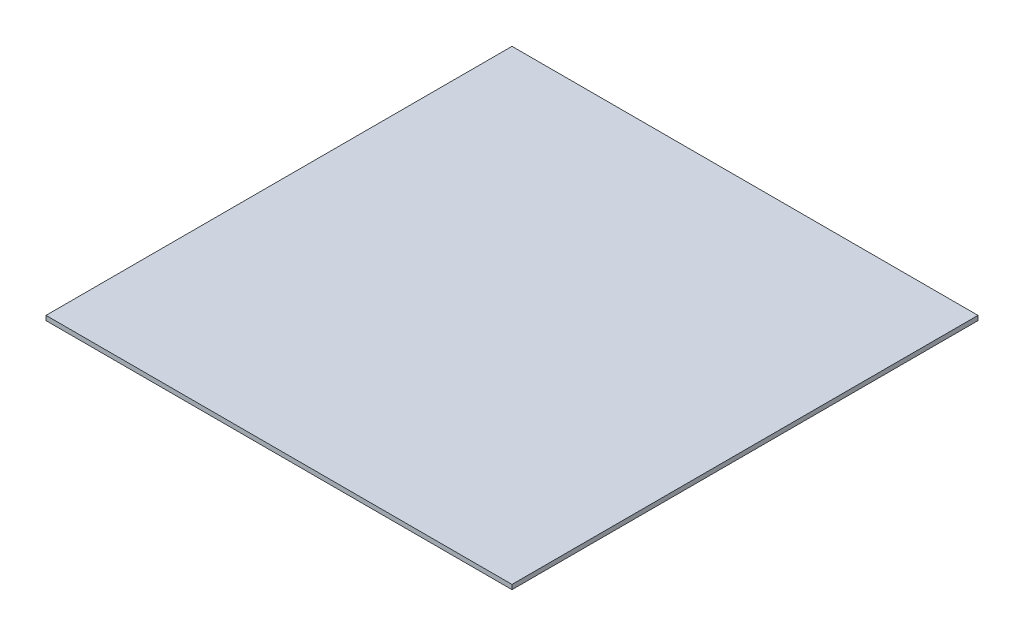
ISO-10303-21;
HEADER;
FILE_DESCRIPTION(('STEP AP214'),'2;1');
FILE_NAME('part.step','',(''),(''),'','','');
FILE_SCHEMA(('AUTOMOTIVE_DESIGN { 1 0 10303 214 1 1 1 1 }'));
ENDSEC;
DATA;
#1=APPLICATION_CONTEXT('core data for automotive mechanical design processes');
#2=APPLICATION_PROTOCOL_DEFINITION('international standard','automotive_design',2000,#1);
#3=PRODUCT_CONTEXT('',#1,'mechanical');
#4=PRODUCT('Part','Part','',(#3));
#5=PRODUCT_RELATED_PRODUCT_CATEGORY('part','',(#4));
#6=PRODUCT_DEFINITION_FORMATION('','',#4);
#7=PRODUCT_DEFINITION_CONTEXT('part definition',#1,'design');
#8=PRODUCT_DEFINITION('design','',#6,#7);
#9=PRODUCT_DEFINITION_SHAPE('','',#8);
#10=(LENGTH_UNIT() NAMED_UNIT(*) SI_UNIT(.MILLI.,.METRE.));
#11=(NAMED_UNIT(*) PLANE_ANGLE_UNIT() SI_UNIT($,.RADIAN.));
#12=(NAMED_UNIT(*) SI_UNIT($,.STERADIAN.) SOLID_ANGLE_UNIT());
#13=UNCERTAINTY_MEASURE_WITH_UNIT(LENGTH_MEASURE(1.E-05),#10,'distance_accuracy_value','');
#14=(GEOMETRIC_REPRESENTATION_CONTEXT(3) GLOBAL_UNCERTAINTY_ASSIGNED_CONTEXT((#13)) GLOBAL_UNIT_ASSIGNED_CONTEXT((#10,
#11,#12)) REPRESENTATION_CONTEXT('',''));
#15=CARTESIAN_POINT('',(0.,0.,0.));
#16=DIRECTION('',(0.,0.,1.));
#17=DIRECTION('',(1.,0.,0.));
#18=AXIS2_PLACEMENT_3D('',#15,#16,#17);
#19=CARTESIAN_POINT('',(152.4,2.9972,152.4));
#20=DIRECTION('',(-1.,0.,0.));
#21=DIRECTION('',(0.,0.,1.));
#22=AXIS2_PLACEMENT_3D('',#19,#20,#21);
#23=PLANE('',#22);
#24=DIRECTION('',(0.,0.,-1.));
#25=VECTOR('',#24,1.);
#26=CARTESIAN_POINT('',(152.4,0.,152.4));
#27=LINE('',#26,#25);
#28=CARTESIAN_POINT('',(152.4,0.,152.4));
#29=VERTEX_POINT('',#28);
#30=CARTESIAN_POINT('',(152.4,0.,-152.4));
#31=VERTEX_POINT('',#30);
#32=EDGE_CURVE('E107',#29,#31,#27,.T.);
#33=ORIENTED_EDGE('',*,*,#32,.T.);
#34=DIRECTION('',(0.,-1.,0.));
#35=VECTOR('',#34,1.);
#36=CARTESIAN_POINT('',(152.4,2.9972,-152.4));
#37=LINE('',#36,#35);
#38=CARTESIAN_POINT('',(152.4,2.9972,-152.4));
#39=VERTEX_POINT('',#38);
#40=EDGE_CURVE('E11',#39,#31,#37,.T.);
#41=ORIENTED_EDGE('',*,*,#40,.F.);
#42=DIRECTION('',(0.,0.,-1.));
#43=VECTOR('',#42,1.);
#44=CARTESIAN_POINT('',(152.4,2.9972,152.4));
#45=LINE('',#44,#43);
#46=CARTESIAN_POINT('',(152.4,2.9972,152.4));
#47=VERTEX_POINT('',#46);
#48=EDGE_CURVE('E91',#47,#39,#45,.T.);
#49=ORIENTED_EDGE('',*,*,#48,.F.);
#50=DIRECTION('',(0.,-1.,0.));
#51=VECTOR('',#50,1.);
#52=CARTESIAN_POINT('',(152.4,2.9972,152.4));
#53=LINE('',#52,#51);
#54=EDGE_CURVE('E103',#47,#29,#53,.T.);
#55=ORIENTED_EDGE('',*,*,#54,.T.);
#56=EDGE_LOOP('',(#33,#41,#49,#55));
#57=FACE_BOUND('',#56,.T.);
#58=ADVANCED_FACE('F39',(#57),#23,.F.);
#59=CARTESIAN_POINT('',(-152.4,2.9972,-152.4));
#60=DIRECTION('',(0.,0.,1.));
#61=DIRECTION('',(1.,0.,0.));
#62=AXIS2_PLACEMENT_3D('',#59,#60,#61);
#63=PLANE('',#62);
#64=DIRECTION('',(-1.,0.,0.));
#65=VECTOR('',#64,1.);
#66=CARTESIAN_POINT('',(-152.4,0.,-152.4));
#67=LINE('',#66,#65);
#68=CARTESIAN_POINT('',(-152.4,0.,-152.4));
#69=VERTEX_POINT('',#68);
#70=EDGE_CURVE('E96',#31,#69,#67,.T.);
#71=ORIENTED_EDGE('',*,*,#70,.T.);
#72=DIRECTION('',(0.,-1.,0.));
#73=VECTOR('',#72,1.);
#74=CARTESIAN_POINT('',(-152.4,2.9972,-152.4));
#75=LINE('',#74,#73);
#76=CARTESIAN_POINT('',(-152.4,2.9972,-152.4));
#77=VERTEX_POINT('',#76);
#78=EDGE_CURVE('E48',#77,#69,#75,.T.);
#79=ORIENTED_EDGE('',*,*,#78,.F.);
#80=DIRECTION('',(-1.,0.,0.));
#81=VECTOR('',#80,1.);
#82=CARTESIAN_POINT('',(-152.4,2.9972,-152.4));
#83=LINE('',#82,#81);
#84=EDGE_CURVE('E86',#39,#77,#83,.T.);
#85=ORIENTED_EDGE('',*,*,#84,.F.);
#86=ORIENTED_EDGE('',*,*,#40,.T.);
#87=EDGE_LOOP('',(#71,#79,#85,#86));
#88=FACE_BOUND('',#87,.T.);
#89=ADVANCED_FACE('F95',(#88),#63,.F.);
#90=CARTESIAN_POINT('',(-152.4,2.9972,152.4));
#91=DIRECTION('',(1.,0.,0.));
#92=DIRECTION('',(0.,0.,-1.));
#93=AXIS2_PLACEMENT_3D('',#90,#91,#92);
#94=PLANE('',#93);
#95=DIRECTION('',(0.,0.,1.));
#96=VECTOR('',#95,1.);
#97=CARTESIAN_POINT('',(-152.4,0.,152.4));
#98=LINE('',#97,#96);
#99=CARTESIAN_POINT('',(-152.4,0.,152.4));
#100=VERTEX_POINT('',#99);
#101=EDGE_CURVE('E73',#69,#100,#98,.T.);
#102=ORIENTED_EDGE('',*,*,#101,.T.);
#103=DIRECTION('',(0.,-1.,0.));
#104=VECTOR('',#103,1.);
#105=CARTESIAN_POINT('',(-152.4,2.9972,152.4));
#106=LINE('',#105,#104);
#107=CARTESIAN_POINT('',(-152.4,2.9972,152.4));
#108=VERTEX_POINT('',#107);
#109=EDGE_CURVE('E98',#108,#100,#106,.T.);
#110=ORIENTED_EDGE('',*,*,#109,.F.);
#111=DIRECTION('',(0.,0.,1.));
#112=VECTOR('',#111,1.);
#113=CARTESIAN_POINT('',(-152.4,2.9972,152.4));
#114=LINE('',#113,#112);
#115=EDGE_CURVE('E89',#77,#108,#114,.T.);
#116=ORIENTED_EDGE('',*,*,#115,.F.);
#117=ORIENTED_EDGE('',*,*,#78,.T.);
#118=EDGE_LOOP('',(#102,#110,#116,#117));
#119=FACE_BOUND('',#118,.T.);
#120=ADVANCED_FACE('F99',(#119),#94,.F.);
#121=CARTESIAN_POINT('',(-152.4,2.9972,152.4));
#122=DIRECTION('',(0.,0.,-1.));
#123=DIRECTION('',(-1.,0.,0.));
#124=AXIS2_PLACEMENT_3D('',#121,#122,#123);
#125=PLANE('',#124);
#126=DIRECTION('',(1.,0.,0.));
#127=VECTOR('',#126,1.);
#128=CARTESIAN_POINT('',(-152.4,0.,152.4));
#129=LINE('',#128,#127);
#130=EDGE_CURVE('E79',#100,#29,#129,.T.);
#131=ORIENTED_EDGE('',*,*,#130,.T.);
#132=ORIENTED_EDGE('',*,*,#54,.F.);
#133=DIRECTION('',(1.,0.,0.));
#134=VECTOR('',#133,1.);
#135=CARTESIAN_POINT('',(-152.4,2.9972,152.4));
#136=LINE('',#135,#134);
#137=EDGE_CURVE('E56',#108,#47,#136,.T.);
#138=ORIENTED_EDGE('',*,*,#137,.F.);
#139=ORIENTED_EDGE('',*,*,#109,.T.);
#140=EDGE_LOOP('',(#131,#132,#138,#139));
#141=FACE_BOUND('',#140,.T.);
#142=ADVANCED_FACE('F120',(#141),#125,.F.);
#143=CARTESIAN_POINT('',(0.,2.9972,0.));
#144=DIRECTION('',(0.,-1.,0.));
#145=DIRECTION('',(0.,0.,-1.));
#146=AXIS2_PLACEMENT_3D('',#143,#144,#145);
#147=PLANE('',#146);
#148=ORIENTED_EDGE('',*,*,#48,.T.);
#149=ORIENTED_EDGE('',*,*,#84,.T.);
#150=ORIENTED_EDGE('',*,*,#115,.T.);
#151=ORIENTED_EDGE('',*,*,#137,.T.);
#152=EDGE_LOOP('',(#148,#149,#150,#151));
#153=FACE_BOUND('',#152,.T.);
#154=ADVANCED_FACE('F87',(#153),#147,.F.);
#155=CARTESIAN_POINT('',(0.,0.,0.));
#156=DIRECTION('',(0.,-1.,0.));
#157=DIRECTION('',(0.,0.,-1.));
#158=AXIS2_PLACEMENT_3D('',#155,#156,#157);
#159=PLANE('',#158);
#160=ORIENTED_EDGE('',*,*,#32,.F.);
#161=ORIENTED_EDGE('',*,*,#130,.F.);
#162=ORIENTED_EDGE('',*,*,#101,.F.);
#163=ORIENTED_EDGE('',*,*,#70,.F.);
#164=EDGE_LOOP('',(#160,#161,#162,#163));
#165=FACE_BOUND('',#164,.T.);
#166=ADVANCED_FACE('F123',(#165),#159,.T.);
#167=CLOSED_SHELL('',(#58,#89,#120,#142,#154,#166));
#168=MANIFOLD_SOLID_BREP('B2',#167);
#169=ADVANCED_BREP_SHAPE_REPRESENTATION('',(#18,#168),#14);
#170=SHAPE_DEFINITION_REPRESENTATION(#9,#169);
ENDSEC;
END-ISO-10303-21;
